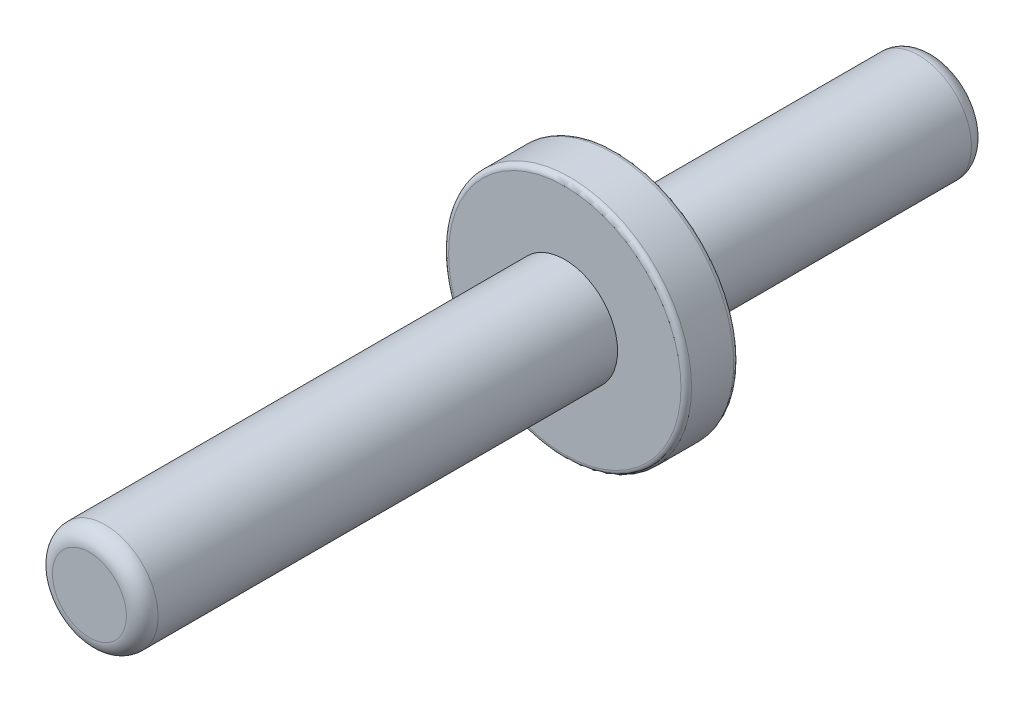
ISO-10303-21;
HEADER;
FILE_DESCRIPTION(('STEP AP214'),'2;1');
FILE_NAME('part.step','',(''),(''),'','','');
FILE_SCHEMA(('AUTOMOTIVE_DESIGN { 1 0 10303 214 1 1 1 1 }'));
ENDSEC;
DATA;
#1=APPLICATION_CONTEXT('core data for automotive mechanical design processes');
#2=APPLICATION_PROTOCOL_DEFINITION('international standard','automotive_design',2000,#1);
#3=PRODUCT_CONTEXT('',#1,'mechanical');
#4=PRODUCT('Part','Part','',(#3));
#5=PRODUCT_RELATED_PRODUCT_CATEGORY('part','',(#4));
#6=PRODUCT_DEFINITION_FORMATION('','',#4);
#7=PRODUCT_DEFINITION_CONTEXT('part definition',#1,'design');
#8=PRODUCT_DEFINITION('design','',#6,#7);
#9=PRODUCT_DEFINITION_SHAPE('','',#8);
#10=(LENGTH_UNIT() NAMED_UNIT(*) SI_UNIT(.MILLI.,.METRE.));
#11=(NAMED_UNIT(*) PLANE_ANGLE_UNIT() SI_UNIT($,.RADIAN.));
#12=(NAMED_UNIT(*) SI_UNIT($,.STERADIAN.) SOLID_ANGLE_UNIT());
#13=UNCERTAINTY_MEASURE_WITH_UNIT(LENGTH_MEASURE(1.E-05),#10,'distance_accuracy_value','');
#14=(GEOMETRIC_REPRESENTATION_CONTEXT(3) GLOBAL_UNCERTAINTY_ASSIGNED_CONTEXT((#13)) GLOBAL_UNIT_ASSIGNED_CONTEXT((#10,
#11,#12)) REPRESENTATION_CONTEXT('',''));
#15=CARTESIAN_POINT('',(0.,0.,0.));
#16=DIRECTION('',(0.,0.,1.));
#17=DIRECTION('',(1.,0.,0.));
#18=AXIS2_PLACEMENT_3D('',#15,#16,#17);
#19=CARTESIAN_POINT('',(0.,0.,0.));
#20=DIRECTION('',(0.,0.,1.));
#21=DIRECTION('',(1.,0.,0.));
#22=AXIS2_PLACEMENT_3D('',#19,#20,#21);
#23=PLANE('',#22);
#24=CARTESIAN_POINT('',(0.,0.,0.));
#25=DIRECTION('',(0.,0.,1.));
#26=DIRECTION('',(1.,0.,0.));
#27=AXIS2_PLACEMENT_3D('',#24,#25,#26);
#28=CIRCLE('',#27,2.2);
#29=CARTESIAN_POINT('',(2.2,0.,0.));
#30=VERTEX_POINT('',#29);
#31=EDGE_CURVE('E37',#30,#30,#28,.F.);
#32=ORIENTED_EDGE('',*,*,#31,.T.);
#33=EDGE_LOOP('',(#32));
#34=FACE_BOUND('',#33,.T.);
#35=CARTESIAN_POINT('',(0.,0.,0.));
#36=DIRECTION('',(0.,0.,1.));
#37=DIRECTION('',(1.,0.,0.));
#38=AXIS2_PLACEMENT_3D('',#35,#36,#37);
#39=CIRCLE('',#38,1.);
#40=CARTESIAN_POINT('',(1.,0.,0.));
#41=VERTEX_POINT('',#40);
#42=EDGE_CURVE('E62',#41,#41,#39,.F.);
#43=ORIENTED_EDGE('',*,*,#42,.F.);
#44=EDGE_LOOP('',(#43));
#45=FACE_BOUND('',#44,.T.);
#46=ADVANCED_FACE('F30',(#34,#45),#23,.F.);
#47=CARTESIAN_POINT('',(0.,0.,1.));
#48=DIRECTION('',(0.,0.,1.));
#49=DIRECTION('',(1.,0.,0.));
#50=AXIS2_PLACEMENT_3D('',#47,#48,#49);
#51=PLANE('',#50);
#52=CARTESIAN_POINT('',(0.,0.,1.));
#53=DIRECTION('',(0.,0.,1.));
#54=DIRECTION('',(1.,0.,0.));
#55=AXIS2_PLACEMENT_3D('',#52,#53,#54);
#56=CIRCLE('',#55,2.2);
#57=CARTESIAN_POINT('',(2.2,0.,1.));
#58=VERTEX_POINT('',#57);
#59=EDGE_CURVE('E10',#58,#58,#56,.T.);
#60=ORIENTED_EDGE('',*,*,#59,.T.);
#61=EDGE_LOOP('',(#60));
#62=FACE_BOUND('',#61,.T.);
#63=CARTESIAN_POINT('',(0.,0.,1.));
#64=DIRECTION('',(0.,0.,1.));
#65=DIRECTION('',(1.,0.,0.));
#66=AXIS2_PLACEMENT_3D('',#63,#64,#65);
#67=CIRCLE('',#66,1.);
#68=CARTESIAN_POINT('',(1.,0.,1.));
#69=VERTEX_POINT('',#68);
#70=EDGE_CURVE('E65',#69,#69,#67,.T.);
#71=ORIENTED_EDGE('',*,*,#70,.F.);
#72=EDGE_LOOP('',(#71));
#73=FACE_BOUND('',#72,.T.);
#74=ADVANCED_FACE('F71',(#62,#73),#51,.T.);
#75=CARTESIAN_POINT('',(0.,0.,1.));
#76=DIRECTION('',(0.,0.,-1.));
#77=DIRECTION('',(-1.,0.,0.));
#78=AXIS2_PLACEMENT_3D('',#75,#76,#77);
#79=CYLINDRICAL_SURFACE('',#78,2.3);
#80=CARTESIAN_POINT('',(0.,0.,0.1));
#81=DIRECTION('',(0.,0.,1.));
#82=DIRECTION('',(1.,0.,0.));
#83=AXIS2_PLACEMENT_3D('',#80,#81,#82);
#84=CIRCLE('',#83,2.3);
#85=CARTESIAN_POINT('',(2.3,0.,0.1));
#86=VERTEX_POINT('',#85);
#87=EDGE_CURVE('E41',#86,#86,#84,.T.);
#88=ORIENTED_EDGE('',*,*,#87,.T.);
#89=EDGE_LOOP('',(#88));
#90=FACE_BOUND('',#89,.T.);
#91=CARTESIAN_POINT('',(0.,0.,0.9));
#92=DIRECTION('',(0.,0.,1.));
#93=DIRECTION('',(1.,0.,0.));
#94=AXIS2_PLACEMENT_3D('',#91,#92,#93);
#95=CIRCLE('',#94,2.3);
#96=CARTESIAN_POINT('',(2.3,0.,0.9));
#97=VERTEX_POINT('',#96);
#98=EDGE_CURVE('E45',#97,#97,#95,.F.);
#99=ORIENTED_EDGE('',*,*,#98,.T.);
#100=EDGE_LOOP('',(#99));
#101=FACE_BOUND('',#100,.T.);
#102=ADVANCED_FACE('F73',(#90,#101),#79,.T.);
#103=CARTESIAN_POINT('',(0.,0.,10.));
#104=DIRECTION('',(0.,0.,-1.));
#105=DIRECTION('',(-1.,0.,0.));
#106=AXIS2_PLACEMENT_3D('',#103,#104,#105);
#107=CYLINDRICAL_SURFACE('',#106,1.);
#108=CARTESIAN_POINT('',(0.,0.,9.7));
#109=DIRECTION('',(0.,0.,1.));
#110=DIRECTION('',(1.,0.,0.));
#111=AXIS2_PLACEMENT_3D('',#108,#109,#110);
#112=CIRCLE('',#111,1.);
#113=CARTESIAN_POINT('',(1.,0.,9.7));
#114=VERTEX_POINT('',#113);
#115=EDGE_CURVE('E56',#114,#114,#112,.F.);
#116=ORIENTED_EDGE('',*,*,#115,.T.);
#117=EDGE_LOOP('',(#116));
#118=FACE_BOUND('',#117,.T.);
#119=ORIENTED_EDGE('',*,*,#70,.T.);
#120=EDGE_LOOP('',(#119));
#121=FACE_BOUND('',#120,.T.);
#122=ADVANCED_FACE('F69',(#118,#121),#107,.T.);
#123=CARTESIAN_POINT('',(0.,0.,10.));
#124=DIRECTION('',(0.,0.,1.));
#125=DIRECTION('',(1.,0.,0.));
#126=AXIS2_PLACEMENT_3D('',#123,#124,#125);
#127=PLANE('',#126);
#128=CARTESIAN_POINT('',(0.,0.,10.));
#129=DIRECTION('',(0.,0.,1.));
#130=DIRECTION('',(1.,0.,0.));
#131=AXIS2_PLACEMENT_3D('',#128,#129,#130);
#132=CIRCLE('',#131,0.7);
#133=CARTESIAN_POINT('',(0.7,0.,10.));
#134=VERTEX_POINT('',#133);
#135=EDGE_CURVE('E59',#134,#134,#132,.T.);
#136=ORIENTED_EDGE('',*,*,#135,.T.);
#137=EDGE_LOOP('',(#136));
#138=FACE_BOUND('',#137,.T.);
#139=ADVANCED_FACE('F161',(#138),#127,.T.);
#140=CARTESIAN_POINT('',(0.,0.,-6.));
#141=DIRECTION('',(0.,0.,1.));
#142=DIRECTION('',(1.,0.,0.));
#143=AXIS2_PLACEMENT_3D('',#140,#141,#142);
#144=CYLINDRICAL_SURFACE('',#143,1.);
#145=CARTESIAN_POINT('',(0.,0.,-5.7));
#146=DIRECTION('',(0.,0.,-1.));
#147=DIRECTION('',(-1.,0.,0.));
#148=AXIS2_PLACEMENT_3D('',#145,#146,#147);
#149=CIRCLE('',#148,1.);
#150=CARTESIAN_POINT('',(-1.,0.,-5.7));
#151=VERTEX_POINT('',#150);
#152=EDGE_CURVE('E50',#151,#151,#149,.F.);
#153=ORIENTED_EDGE('',*,*,#152,.T.);
#154=EDGE_LOOP('',(#153));
#155=FACE_BOUND('',#154,.T.);
#156=ORIENTED_EDGE('',*,*,#42,.T.);
#157=EDGE_LOOP('',(#156));
#158=FACE_BOUND('',#157,.T.);
#159=ADVANCED_FACE('F152',(#155,#158),#144,.T.);
#160=CARTESIAN_POINT('',(0.,0.,-6.));
#161=DIRECTION('',(0.,0.,-1.));
#162=DIRECTION('',(-1.,0.,0.));
#163=AXIS2_PLACEMENT_3D('',#160,#161,#162);
#164=PLANE('',#163);
#165=CARTESIAN_POINT('',(0.,0.,-6.));
#166=DIRECTION('',(0.,0.,-1.));
#167=DIRECTION('',(-1.,0.,0.));
#168=AXIS2_PLACEMENT_3D('',#165,#166,#167);
#169=CIRCLE('',#168,0.7);
#170=CARTESIAN_POINT('',(-0.7,0.,-6.));
#171=VERTEX_POINT('',#170);
#172=EDGE_CURVE('E53',#171,#171,#169,.T.);
#173=ORIENTED_EDGE('',*,*,#172,.T.);
#174=EDGE_LOOP('',(#173));
#175=FACE_BOUND('',#174,.T.);
#176=ADVANCED_FACE('F89',(#175),#164,.T.);
#177=CARTESIAN_POINT('',(0.,0.,9.7));
#178=DIRECTION('',(0.,0.,1.));
#179=DIRECTION('',(1.,0.,0.));
#180=AXIS2_PLACEMENT_3D('',#177,#178,#179);
#181=TOROIDAL_SURFACE('',#180,0.7,0.3);
#182=ORIENTED_EDGE('',*,*,#115,.F.);
#183=EDGE_LOOP('',(#182));
#184=FACE_BOUND('',#183,.T.);
#185=ORIENTED_EDGE('',*,*,#135,.F.);
#186=EDGE_LOOP('',(#185));
#187=FACE_BOUND('',#186,.T.);
#188=ADVANCED_FACE('F85',(#184,#187),#181,.T.);
#189=CARTESIAN_POINT('',(0.,0.,-5.7));
#190=DIRECTION('',(0.,0.,-1.));
#191=DIRECTION('',(-1.,0.,0.));
#192=AXIS2_PLACEMENT_3D('',#189,#190,#191);
#193=TOROIDAL_SURFACE('',#192,0.7,0.3);
#194=ORIENTED_EDGE('',*,*,#152,.F.);
#195=EDGE_LOOP('',(#194));
#196=FACE_BOUND('',#195,.T.);
#197=ORIENTED_EDGE('',*,*,#172,.F.);
#198=EDGE_LOOP('',(#197));
#199=FACE_BOUND('',#198,.T.);
#200=ADVANCED_FACE('F88',(#196,#199),#193,.T.);
#201=CARTESIAN_POINT('',(0.,0.,0.1));
#202=DIRECTION('',(0.,0.,1.));
#203=DIRECTION('',(1.,0.,0.));
#204=AXIS2_PLACEMENT_3D('',#201,#202,#203);
#205=TOROIDAL_SURFACE('',#204,2.2,0.1);
#206=ORIENTED_EDGE('',*,*,#31,.F.);
#207=EDGE_LOOP('',(#206));
#208=FACE_BOUND('',#207,.T.);
#209=ORIENTED_EDGE('',*,*,#87,.F.);
#210=EDGE_LOOP('',(#209));
#211=FACE_BOUND('',#210,.T.);
#212=ADVANCED_FACE('F92',(#208,#211),#205,.T.);
#213=CARTESIAN_POINT('',(0.,0.,0.9));
#214=DIRECTION('',(0.,0.,1.));
#215=DIRECTION('',(1.,0.,0.));
#216=AXIS2_PLACEMENT_3D('',#213,#214,#215);
#217=TOROIDAL_SURFACE('',#216,2.2,0.1);
#218=ORIENTED_EDGE('',*,*,#98,.F.);
#219=EDGE_LOOP('',(#218));
#220=FACE_BOUND('',#219,.T.);
#221=ORIENTED_EDGE('',*,*,#59,.F.);
#222=EDGE_LOOP('',(#221));
#223=FACE_BOUND('',#222,.T.);
#224=ADVANCED_FACE('F32',(#220,#223),#217,.T.);
#225=CLOSED_SHELL('',(#46,#74,#102,#122,#139,#159,#176,#188,#200,#212,#224));
#226=MANIFOLD_SOLID_BREP('B2',#225);
#227=ADVANCED_BREP_SHAPE_REPRESENTATION('',(#18,#226),#14);
#228=SHAPE_DEFINITION_REPRESENTATION(#9,#227);
ENDSEC;
END-ISO-10303-21;
